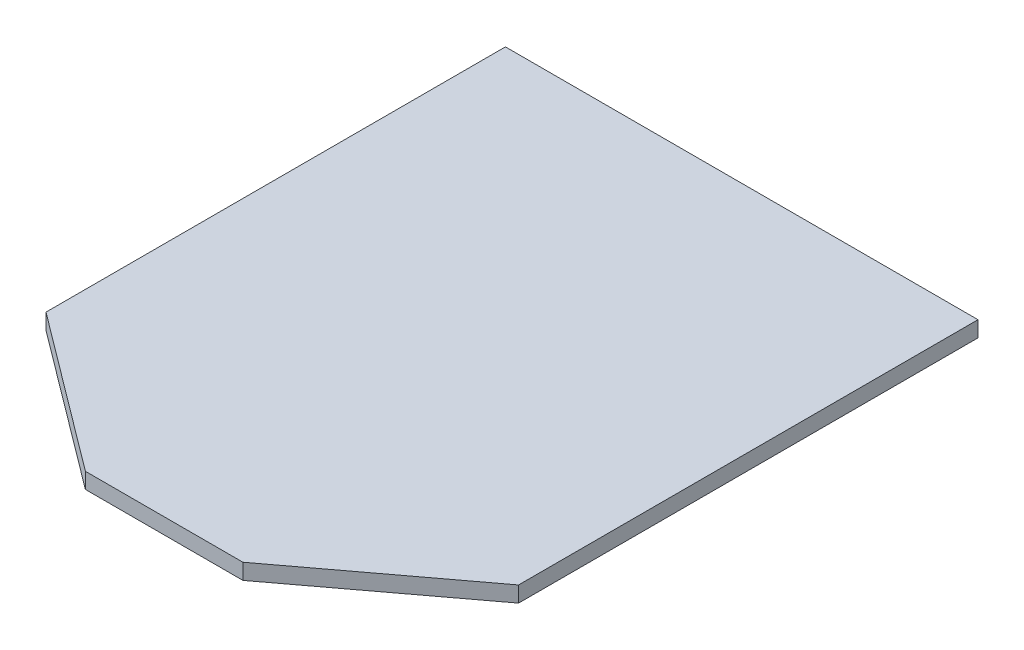
ISO-10303-21;
HEADER;
FILE_DESCRIPTION(('STEP AP214'),'2;1');
FILE_NAME('part.step','',(''),(''),'','','');
FILE_SCHEMA(('AUTOMOTIVE_DESIGN { 1 0 10303 214 1 1 1 1 }'));
ENDSEC;
DATA;
#1=APPLICATION_CONTEXT('core data for automotive mechanical design processes');
#2=APPLICATION_PROTOCOL_DEFINITION('international standard','automotive_design',2000,#1);
#3=PRODUCT_CONTEXT('',#1,'mechanical');
#4=PRODUCT('Part','Part','',(#3));
#5=PRODUCT_RELATED_PRODUCT_CATEGORY('part','',(#4));
#6=PRODUCT_DEFINITION_FORMATION('','',#4);
#7=PRODUCT_DEFINITION_CONTEXT('part definition',#1,'design');
#8=PRODUCT_DEFINITION('design','',#6,#7);
#9=PRODUCT_DEFINITION_SHAPE('','',#8);
#10=(LENGTH_UNIT() NAMED_UNIT(*) SI_UNIT(.MILLI.,.METRE.));
#11=(NAMED_UNIT(*) PLANE_ANGLE_UNIT() SI_UNIT($,.RADIAN.));
#12=(NAMED_UNIT(*) SI_UNIT($,.STERADIAN.) SOLID_ANGLE_UNIT());
#13=UNCERTAINTY_MEASURE_WITH_UNIT(LENGTH_MEASURE(1.E-05),#10,'distance_accuracy_value','');
#14=(GEOMETRIC_REPRESENTATION_CONTEXT(3) GLOBAL_UNCERTAINTY_ASSIGNED_CONTEXT((#13)) GLOBAL_UNIT_ASSIGNED_CONTEXT((#10,
#11,#12)) REPRESENTATION_CONTEXT('',''));
#15=CARTESIAN_POINT('',(0.,0.,0.));
#16=DIRECTION('',(0.,0.,1.));
#17=DIRECTION('',(1.,0.,0.));
#18=AXIS2_PLACEMENT_3D('',#15,#16,#17);
#19=CARTESIAN_POINT('',(90.,6.,110.));
#20=DIRECTION('',(-1.,0.,0.));
#21=DIRECTION('',(0.,0.,1.));
#22=AXIS2_PLACEMENT_3D('',#19,#20,#21);
#23=PLANE('',#22);
#24=DIRECTION('',(0.,0.,-1.));
#25=VECTOR('',#24,1.);
#26=CARTESIAN_POINT('',(90.,6.,110.));
#27=LINE('',#26,#25);
#28=CARTESIAN_POINT('',(90.,6.,65.));
#29=VERTEX_POINT('',#28);
#30=CARTESIAN_POINT('',(90.,6.,-110.));
#31=VERTEX_POINT('',#30);
#32=EDGE_CURVE('E104',#29,#31,#27,.T.);
#33=ORIENTED_EDGE('',*,*,#32,.F.);
#34=DIRECTION('',(0.,1.,0.));
#35=VECTOR('',#34,1.);
#36=CARTESIAN_POINT('',(90.,0.,65.));
#37=LINE('',#36,#35);
#38=CARTESIAN_POINT('',(90.,0.,65.));
#39=VERTEX_POINT('',#38);
#40=EDGE_CURVE('E135',#39,#29,#37,.T.);
#41=ORIENTED_EDGE('',*,*,#40,.F.);
#42=DIRECTION('',(0.,0.,-1.));
#43=VECTOR('',#42,1.);
#44=CARTESIAN_POINT('',(90.,0.,110.));
#45=LINE('',#44,#43);
#46=CARTESIAN_POINT('',(90.,0.,-110.));
#47=VERTEX_POINT('',#46);
#48=EDGE_CURVE('E124',#39,#47,#45,.T.);
#49=ORIENTED_EDGE('',*,*,#48,.T.);
#50=DIRECTION('',(0.,-1.,0.));
#51=VECTOR('',#50,1.);
#52=CARTESIAN_POINT('',(90.,6.,-110.));
#53=LINE('',#52,#51);
#54=EDGE_CURVE('E11',#31,#47,#53,.T.);
#55=ORIENTED_EDGE('',*,*,#54,.F.);
#56=EDGE_LOOP('',(#33,#41,#49,#55));
#57=FACE_BOUND('',#56,.T.);
#58=ADVANCED_FACE('F33',(#57),#23,.F.);
#59=CARTESIAN_POINT('',(-90.,6.,-110.));
#60=DIRECTION('',(0.,0.,1.));
#61=DIRECTION('',(1.,0.,0.));
#62=AXIS2_PLACEMENT_3D('',#59,#60,#61);
#63=PLANE('',#62);
#64=DIRECTION('',(-1.,0.,0.));
#65=VECTOR('',#64,1.);
#66=CARTESIAN_POINT('',(-90.,0.,-110.));
#67=LINE('',#66,#65);
#68=CARTESIAN_POINT('',(-90.,0.,-110.));
#69=VERTEX_POINT('',#68);
#70=EDGE_CURVE('E109',#47,#69,#67,.T.);
#71=ORIENTED_EDGE('',*,*,#70,.T.);
#72=DIRECTION('',(0.,-1.,0.));
#73=VECTOR('',#72,1.);
#74=CARTESIAN_POINT('',(-90.,6.,-110.));
#75=LINE('',#74,#73);
#76=CARTESIAN_POINT('',(-90.,6.,-110.));
#77=VERTEX_POINT('',#76);
#78=EDGE_CURVE('E40',#77,#69,#75,.T.);
#79=ORIENTED_EDGE('',*,*,#78,.F.);
#80=DIRECTION('',(-1.,0.,0.));
#81=VECTOR('',#80,1.);
#82=CARTESIAN_POINT('',(-90.,6.,-110.));
#83=LINE('',#82,#81);
#84=EDGE_CURVE('E107',#31,#77,#83,.T.);
#85=ORIENTED_EDGE('',*,*,#84,.F.);
#86=ORIENTED_EDGE('',*,*,#54,.T.);
#87=EDGE_LOOP('',(#71,#79,#85,#86));
#88=FACE_BOUND('',#87,.T.);
#89=ADVANCED_FACE('F127',(#88),#63,.F.);
#90=CARTESIAN_POINT('',(-90.,6.,110.));
#91=DIRECTION('',(1.,0.,0.));
#92=DIRECTION('',(0.,0.,-1.));
#93=AXIS2_PLACEMENT_3D('',#90,#91,#92);
#94=PLANE('',#93);
#95=DIRECTION('',(0.,0.,1.));
#96=VECTOR('',#95,1.);
#97=CARTESIAN_POINT('',(-90.,0.,110.));
#98=LINE('',#97,#96);
#99=CARTESIAN_POINT('',(-90.,0.,65.0000000000001));
#100=VERTEX_POINT('',#99);
#101=EDGE_CURVE('E105',#69,#100,#98,.T.);
#102=ORIENTED_EDGE('',*,*,#101,.T.);
#103=DIRECTION('',(0.,1.,0.));
#104=VECTOR('',#103,1.);
#105=CARTESIAN_POINT('',(-90.,0.,65.));
#106=LINE('',#105,#104);
#107=CARTESIAN_POINT('',(-90.,6.,65.));
#108=VERTEX_POINT('',#107);
#109=EDGE_CURVE('E47',#100,#108,#106,.T.);
#110=ORIENTED_EDGE('',*,*,#109,.T.);
#111=DIRECTION('',(0.,0.,1.));
#112=VECTOR('',#111,1.);
#113=CARTESIAN_POINT('',(-90.,6.,110.));
#114=LINE('',#113,#112);
#115=EDGE_CURVE('E116',#77,#108,#114,.T.);
#116=ORIENTED_EDGE('',*,*,#115,.F.);
#117=ORIENTED_EDGE('',*,*,#78,.T.);
#118=EDGE_LOOP('',(#102,#110,#116,#117));
#119=FACE_BOUND('',#118,.T.);
#120=ADVANCED_FACE('F130',(#119),#94,.F.);
#121=CARTESIAN_POINT('',(-90.,6.,110.));
#122=DIRECTION('',(0.,0.,-1.));
#123=DIRECTION('',(-1.,0.,0.));
#124=AXIS2_PLACEMENT_3D('',#121,#122,#123);
#125=PLANE('',#124);
#126=DIRECTION('',(1.,0.,0.));
#127=VECTOR('',#126,1.);
#128=CARTESIAN_POINT('',(-90.,6.,110.));
#129=LINE('',#128,#127);
#130=CARTESIAN_POINT('',(-30.,6.,110.));
#131=VERTEX_POINT('',#130);
#132=CARTESIAN_POINT('',(30.,6.,110.));
#133=VERTEX_POINT('',#132);
#134=EDGE_CURVE('E99',#131,#133,#129,.T.);
#135=ORIENTED_EDGE('',*,*,#134,.F.);
#136=DIRECTION('',(0.,1.,0.));
#137=VECTOR('',#136,1.);
#138=CARTESIAN_POINT('',(-30.,0.,110.));
#139=LINE('',#138,#137);
#140=CARTESIAN_POINT('',(-30.,0.,110.));
#141=VERTEX_POINT('',#140);
#142=EDGE_CURVE('E85',#141,#131,#139,.T.);
#143=ORIENTED_EDGE('',*,*,#142,.F.);
#144=DIRECTION('',(1.,0.,0.));
#145=VECTOR('',#144,1.);
#146=CARTESIAN_POINT('',(-90.,0.,110.));
#147=LINE('',#146,#145);
#148=CARTESIAN_POINT('',(29.9999999999999,0.,110.));
#149=VERTEX_POINT('',#148);
#150=EDGE_CURVE('E97',#141,#149,#147,.T.);
#151=ORIENTED_EDGE('',*,*,#150,.T.);
#152=DIRECTION('',(0.,1.,0.));
#153=VECTOR('',#152,1.);
#154=CARTESIAN_POINT('',(30.,0.,110.));
#155=LINE('',#154,#153);
#156=EDGE_CURVE('E55',#149,#133,#155,.T.);
#157=ORIENTED_EDGE('',*,*,#156,.T.);
#158=EDGE_LOOP('',(#135,#143,#151,#157));
#159=FACE_BOUND('',#158,.T.);
#160=ADVANCED_FACE('F96',(#159),#125,.F.);
#161=CARTESIAN_POINT('',(0.,6.,0.));
#162=DIRECTION('',(0.,-1.,0.));
#163=DIRECTION('',(0.,0.,-1.));
#164=AXIS2_PLACEMENT_3D('',#161,#162,#163);
#165=PLANE('',#164);
#166=ORIENTED_EDGE('',*,*,#115,.T.);
#167=DIRECTION('',(-0.8,0.,-0.6));
#168=VECTOR('',#167,1.);
#169=CARTESIAN_POINT('',(-30.,6.,110.));
#170=LINE('',#169,#168);
#171=EDGE_CURVE('E91',#131,#108,#170,.T.);
#172=ORIENTED_EDGE('',*,*,#171,.F.);
#173=ORIENTED_EDGE('',*,*,#134,.T.);
#174=DIRECTION('',(-0.8,0.,0.6));
#175=VECTOR('',#174,1.);
#176=CARTESIAN_POINT('',(30.,6.,110.));
#177=LINE('',#176,#175);
#178=EDGE_CURVE('E138',#29,#133,#177,.T.);
#179=ORIENTED_EDGE('',*,*,#178,.F.);
#180=ORIENTED_EDGE('',*,*,#32,.T.);
#181=ORIENTED_EDGE('',*,*,#84,.T.);
#182=EDGE_LOOP('',(#166,#172,#173,#179,#180,#181));
#183=FACE_BOUND('',#182,.T.);
#184=ADVANCED_FACE('F132',(#183),#165,.F.);
#185=CARTESIAN_POINT('',(0.,0.,0.));
#186=DIRECTION('',(0.,-1.,0.));
#187=DIRECTION('',(0.,0.,-1.));
#188=AXIS2_PLACEMENT_3D('',#185,#186,#187);
#189=PLANE('',#188);
#190=DIRECTION('',(-0.8,0.,-0.6));
#191=VECTOR('',#190,1.);
#192=CARTESIAN_POINT('',(-30.,0.,110.));
#193=LINE('',#192,#191);
#194=EDGE_CURVE('E82',#141,#100,#193,.T.);
#195=ORIENTED_EDGE('',*,*,#194,.T.);
#196=ORIENTED_EDGE('',*,*,#101,.F.);
#197=ORIENTED_EDGE('',*,*,#70,.F.);
#198=ORIENTED_EDGE('',*,*,#48,.F.);
#199=DIRECTION('',(-0.8,0.,0.6));
#200=VECTOR('',#199,1.);
#201=CARTESIAN_POINT('',(30.,0.,110.));
#202=LINE('',#201,#200);
#203=EDGE_CURVE('E103',#39,#149,#202,.T.);
#204=ORIENTED_EDGE('',*,*,#203,.T.);
#205=ORIENTED_EDGE('',*,*,#150,.F.);
#206=EDGE_LOOP('',(#195,#196,#197,#198,#204,#205));
#207=FACE_BOUND('',#206,.T.);
#208=ADVANCED_FACE('F101',(#207),#189,.T.);
#209=CARTESIAN_POINT('',(30.,0.,110.));
#210=DIRECTION('',(-0.6,0.,-0.8));
#211=DIRECTION('',(-0.8,0.,0.6));
#212=AXIS2_PLACEMENT_3D('',#209,#210,#211);
#213=PLANE('',#212);
#214=ORIENTED_EDGE('',*,*,#178,.T.);
#215=ORIENTED_EDGE('',*,*,#156,.F.);
#216=ORIENTED_EDGE('',*,*,#203,.F.);
#217=ORIENTED_EDGE('',*,*,#40,.T.);
#218=EDGE_LOOP('',(#214,#215,#216,#217));
#219=FACE_BOUND('',#218,.T.);
#220=ADVANCED_FACE('F141',(#219),#213,.F.);
#221=CARTESIAN_POINT('',(-30.,0.,110.));
#222=DIRECTION('',(0.6,0.,-0.8));
#223=DIRECTION('',(-0.8,0.,-0.6));
#224=AXIS2_PLACEMENT_3D('',#221,#222,#223);
#225=PLANE('',#224);
#226=ORIENTED_EDGE('',*,*,#171,.T.);
#227=ORIENTED_EDGE('',*,*,#109,.F.);
#228=ORIENTED_EDGE('',*,*,#194,.F.);
#229=ORIENTED_EDGE('',*,*,#142,.T.);
#230=EDGE_LOOP('',(#226,#227,#228,#229));
#231=FACE_BOUND('',#230,.T.);
#232=ADVANCED_FACE('F84',(#231),#225,.F.);
#233=CLOSED_SHELL('',(#58,#89,#120,#160,#184,#208,#220,#232));
#234=MANIFOLD_SOLID_BREP('B2',#233);
#235=ADVANCED_BREP_SHAPE_REPRESENTATION('',(#18,#234),#14);
#236=SHAPE_DEFINITION_REPRESENTATION(#9,#235);
ENDSEC;
END-ISO-10303-21;
